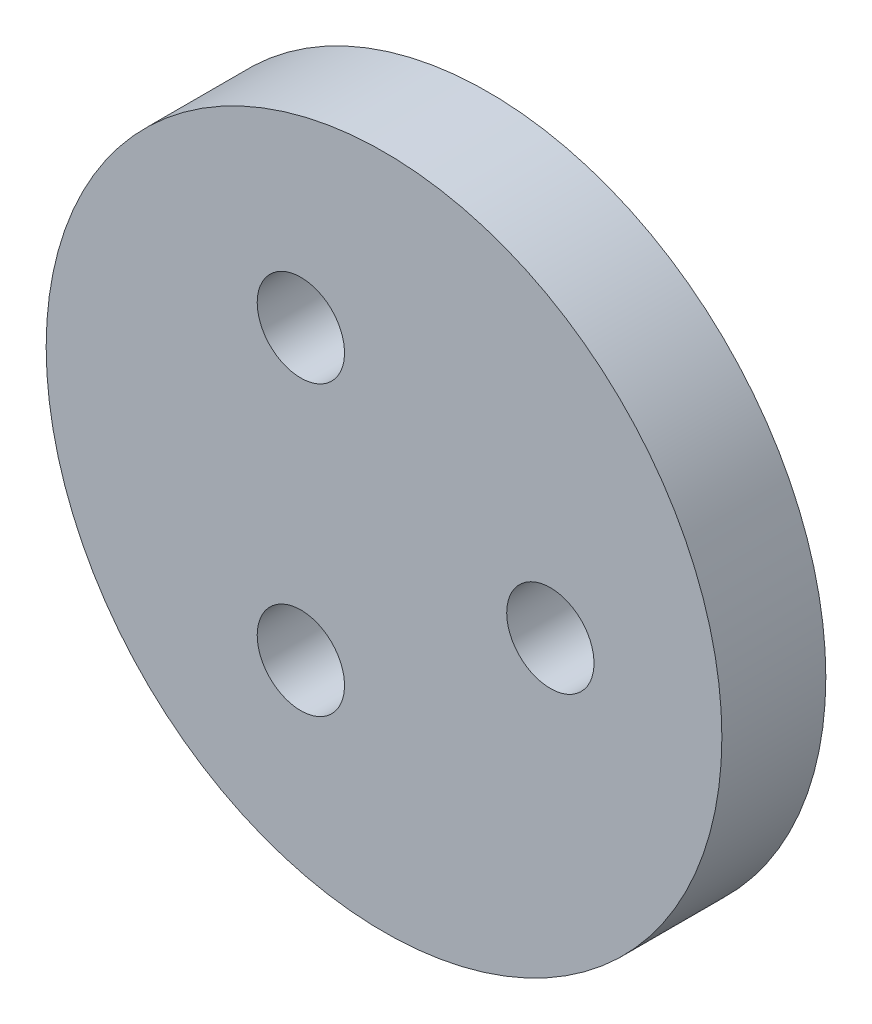
ISO-10303-21;
HEADER;
FILE_DESCRIPTION(('STEP AP214'),'2;1');
FILE_NAME('part.step','',(''),(''),'','','');
FILE_SCHEMA(('AUTOMOTIVE_DESIGN { 1 0 10303 214 1 1 1 1 }'));
ENDSEC;
DATA;
#1=APPLICATION_CONTEXT('core data for automotive mechanical design processes');
#2=APPLICATION_PROTOCOL_DEFINITION('international standard','automotive_design',2000,#1);
#3=PRODUCT_CONTEXT('',#1,'mechanical');
#4=PRODUCT('Part','Part','',(#3));
#5=PRODUCT_RELATED_PRODUCT_CATEGORY('part','',(#4));
#6=PRODUCT_DEFINITION_FORMATION('','',#4);
#7=PRODUCT_DEFINITION_CONTEXT('part definition',#1,'design');
#8=PRODUCT_DEFINITION('design','',#6,#7);
#9=PRODUCT_DEFINITION_SHAPE('','',#8);
#10=(LENGTH_UNIT() NAMED_UNIT(*) SI_UNIT(.MILLI.,.METRE.));
#11=(NAMED_UNIT(*) PLANE_ANGLE_UNIT() SI_UNIT($,.RADIAN.));
#12=(NAMED_UNIT(*) SI_UNIT($,.STERADIAN.) SOLID_ANGLE_UNIT());
#13=UNCERTAINTY_MEASURE_WITH_UNIT(LENGTH_MEASURE(1.E-05),#10,'distance_accuracy_value','');
#14=(GEOMETRIC_REPRESENTATION_CONTEXT(3) GLOBAL_UNCERTAINTY_ASSIGNED_CONTEXT((#13)) GLOBAL_UNIT_ASSIGNED_CONTEXT((#10,
#11,#12)) REPRESENTATION_CONTEXT('',''));
#15=CARTESIAN_POINT('',(0.,0.,0.));
#16=DIRECTION('',(0.,0.,1.));
#17=DIRECTION('',(1.,0.,0.));
#18=AXIS2_PLACEMENT_3D('',#15,#16,#17);
#19=CARTESIAN_POINT('',(0.,0.,0.));
#20=DIRECTION('',(0.,0.,1.));
#21=DIRECTION('',(1.,0.,0.));
#22=AXIS2_PLACEMENT_3D('',#19,#20,#21);
#23=CYLINDRICAL_SURFACE('',#22,32.5);
#24=CARTESIAN_POINT('',(0.,0.,0.));
#25=DIRECTION('',(0.,0.,1.));
#26=DIRECTION('',(-1.,0.,0.));
#27=AXIS2_PLACEMENT_3D('',#24,#25,#26);
#28=CIRCLE('',#27,32.5);
#29=CARTESIAN_POINT('',(-32.5,0.,0.));
#30=VERTEX_POINT('',#29);
#31=EDGE_CURVE('E10',#30,#30,#28,.T.);
#32=ORIENTED_EDGE('',*,*,#31,.T.);
#33=EDGE_LOOP('',(#32));
#34=FACE_BOUND('',#33,.T.);
#35=CARTESIAN_POINT('',(0.,0.,10.));
#36=DIRECTION('',(0.,0.,1.));
#37=DIRECTION('',(-1.,0.,0.));
#38=AXIS2_PLACEMENT_3D('',#35,#36,#37);
#39=CIRCLE('',#38,32.5);
#40=CARTESIAN_POINT('',(-32.5,0.,10.));
#41=VERTEX_POINT('',#40);
#42=EDGE_CURVE('E44',#41,#41,#39,.T.);
#43=ORIENTED_EDGE('',*,*,#42,.F.);
#44=EDGE_LOOP('',(#43));
#45=FACE_BOUND('',#44,.T.);
#46=ADVANCED_FACE('F41',(#34,#45),#23,.T.);
#47=CARTESIAN_POINT('',(0.,0.,0.));
#48=DIRECTION('',(0.,0.,-1.));
#49=DIRECTION('',(-1.,0.,0.));
#50=AXIS2_PLACEMENT_3D('',#47,#48,#49);
#51=PLANE('',#50);
#52=CARTESIAN_POINT('',(16.0000000000006,1.7347234759768E-13,0.));
#53=DIRECTION('',(0.,0.,1.));
#54=DIRECTION('',(-1.,0.,0.));
#55=AXIS2_PLACEMENT_3D('',#52,#53,#54);
#56=CIRCLE('',#55,4.2);
#57=CARTESIAN_POINT('',(11.8000000000006,1.7347234759768E-13,0.));
#58=VERTEX_POINT('',#57);
#59=EDGE_CURVE('E62',#58,#58,#56,.T.);
#60=ORIENTED_EDGE('',*,*,#59,.T.);
#61=EDGE_LOOP('',(#60));
#62=FACE_BOUND('',#61,.T.);
#63=CARTESIAN_POINT('',(-8.00000000000014,-13.8564064605516,0.));
#64=DIRECTION('',(0.,0.,1.));
#65=DIRECTION('',(-1.,0.,0.));
#66=AXIS2_PLACEMENT_3D('',#63,#64,#65);
#67=CIRCLE('',#66,4.2);
#68=CARTESIAN_POINT('',(-12.2000000000001,-13.8564064605516,0.));
#69=VERTEX_POINT('',#68);
#70=EDGE_CURVE('E56',#69,#69,#67,.T.);
#71=ORIENTED_EDGE('',*,*,#70,.T.);
#72=EDGE_LOOP('',(#71));
#73=FACE_BOUND('',#72,.T.);
#74=CARTESIAN_POINT('',(-8.00000000000045,13.8564064605515,0.));
#75=DIRECTION('',(0.,0.,1.));
#76=DIRECTION('',(-1.,0.,0.));
#77=AXIS2_PLACEMENT_3D('',#74,#75,#76);
#78=CIRCLE('',#77,4.2);
#79=CARTESIAN_POINT('',(-12.2000000000005,13.8564064605515,0.));
#80=VERTEX_POINT('',#79);
#81=EDGE_CURVE('E51',#80,#80,#78,.T.);
#82=ORIENTED_EDGE('',*,*,#81,.T.);
#83=EDGE_LOOP('',(#82));
#84=FACE_BOUND('',#83,.T.);
#85=ORIENTED_EDGE('',*,*,#31,.F.);
#86=EDGE_LOOP('',(#85));
#87=FACE_BOUND('',#86,.T.);
#88=ADVANCED_FACE('F71',(#62,#73,#84,#87),#51,.T.);
#89=CARTESIAN_POINT('',(0.,0.,10.));
#90=DIRECTION('',(0.,0.,-1.));
#91=DIRECTION('',(-1.,0.,0.));
#92=AXIS2_PLACEMENT_3D('',#89,#90,#91);
#93=PLANE('',#92);
#94=CARTESIAN_POINT('',(16.0000000000006,1.7347234759768E-13,10.));
#95=DIRECTION('',(0.,0.,1.));
#96=DIRECTION('',(-1.,0.,0.));
#97=AXIS2_PLACEMENT_3D('',#94,#95,#96);
#98=CIRCLE('',#97,4.2);
#99=CARTESIAN_POINT('',(11.8000000000006,1.7347234759768E-13,10.));
#100=VERTEX_POINT('',#99);
#101=EDGE_CURVE('E65',#100,#100,#98,.T.);
#102=ORIENTED_EDGE('',*,*,#101,.F.);
#103=EDGE_LOOP('',(#102));
#104=FACE_BOUND('',#103,.T.);
#105=CARTESIAN_POINT('',(-8.00000000000014,-13.8564064605516,10.));
#106=DIRECTION('',(0.,0.,1.));
#107=DIRECTION('',(-1.,0.,0.));
#108=AXIS2_PLACEMENT_3D('',#105,#106,#107);
#109=CIRCLE('',#108,4.2);
#110=CARTESIAN_POINT('',(-12.2000000000001,-13.8564064605516,10.));
#111=VERTEX_POINT('',#110);
#112=EDGE_CURVE('E59',#111,#111,#109,.T.);
#113=ORIENTED_EDGE('',*,*,#112,.F.);
#114=EDGE_LOOP('',(#113));
#115=FACE_BOUND('',#114,.T.);
#116=CARTESIAN_POINT('',(-8.00000000000045,13.8564064605515,10.));
#117=DIRECTION('',(0.,0.,1.));
#118=DIRECTION('',(-1.,0.,0.));
#119=AXIS2_PLACEMENT_3D('',#116,#117,#118);
#120=CIRCLE('',#119,4.2);
#121=CARTESIAN_POINT('',(-12.2000000000005,13.8564064605515,10.));
#122=VERTEX_POINT('',#121);
#123=EDGE_CURVE('E53',#122,#122,#120,.T.);
#124=ORIENTED_EDGE('',*,*,#123,.F.);
#125=EDGE_LOOP('',(#124));
#126=FACE_BOUND('',#125,.T.);
#127=ORIENTED_EDGE('',*,*,#42,.T.);
#128=EDGE_LOOP('',(#127));
#129=FACE_BOUND('',#128,.T.);
#130=ADVANCED_FACE('F81',(#104,#115,#126,#129),#93,.F.);
#131=CARTESIAN_POINT('',(-8.00000000000045,13.8564064605515,0.));
#132=DIRECTION('',(0.,0.,1.));
#133=DIRECTION('',(1.,0.,0.));
#134=AXIS2_PLACEMENT_3D('',#131,#132,#133);
#135=CYLINDRICAL_SURFACE('',#134,4.2);
#136=ORIENTED_EDGE('',*,*,#81,.F.);
#137=EDGE_LOOP('',(#136));
#138=FACE_BOUND('',#137,.T.);
#139=ORIENTED_EDGE('',*,*,#123,.T.);
#140=EDGE_LOOP('',(#139));
#141=FACE_BOUND('',#140,.T.);
#142=ADVANCED_FACE('F84',(#138,#141),#135,.F.);
#143=CARTESIAN_POINT('',(-8.00000000000014,-13.8564064605516,0.));
#144=DIRECTION('',(0.,0.,1.));
#145=DIRECTION('',(1.,0.,0.));
#146=AXIS2_PLACEMENT_3D('',#143,#144,#145);
#147=CYLINDRICAL_SURFACE('',#146,4.2);
#148=ORIENTED_EDGE('',*,*,#70,.F.);
#149=EDGE_LOOP('',(#148));
#150=FACE_BOUND('',#149,.T.);
#151=ORIENTED_EDGE('',*,*,#112,.T.);
#152=EDGE_LOOP('',(#151));
#153=FACE_BOUND('',#152,.T.);
#154=ADVANCED_FACE('F77',(#150,#153),#147,.F.);
#155=CARTESIAN_POINT('',(16.0000000000006,1.7347234759768E-13,0.));
#156=DIRECTION('',(0.,0.,1.));
#157=DIRECTION('',(1.,0.,0.));
#158=AXIS2_PLACEMENT_3D('',#155,#156,#157);
#159=CYLINDRICAL_SURFACE('',#158,4.2);
#160=ORIENTED_EDGE('',*,*,#59,.F.);
#161=EDGE_LOOP('',(#160));
#162=FACE_BOUND('',#161,.T.);
#163=ORIENTED_EDGE('',*,*,#101,.T.);
#164=EDGE_LOOP('',(#163));
#165=FACE_BOUND('',#164,.T.);
#166=ADVANCED_FACE('F74',(#162,#165),#159,.F.);
#167=CLOSED_SHELL('',(#46,#88,#130,#142,#154,#166));
#168=MANIFOLD_SOLID_BREP('B2',#167);
#169=ADVANCED_BREP_SHAPE_REPRESENTATION('',(#18,#168),#14);
#170=SHAPE_DEFINITION_REPRESENTATION(#9,#169);
ENDSEC;
END-ISO-10303-21;
